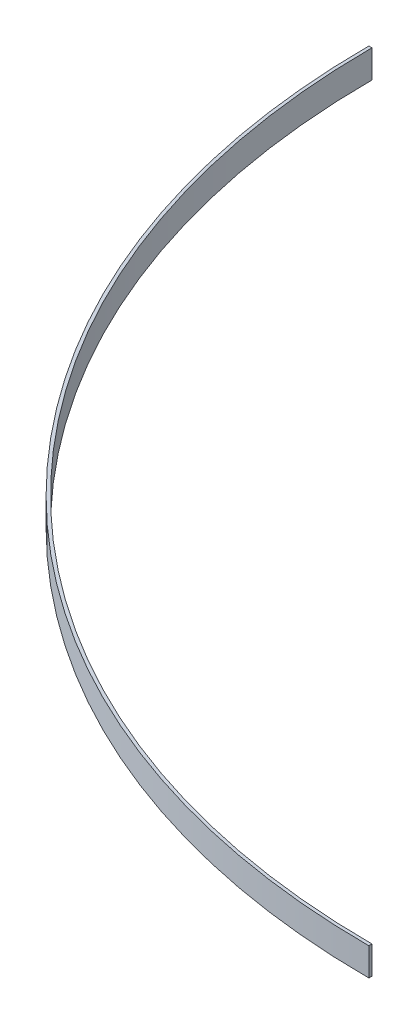
ISO-10303-21;
HEADER;
FILE_DESCRIPTION(('STEP AP214'),'2;1');
FILE_NAME('part.step','',(''),(''),'','','');
FILE_SCHEMA(('AUTOMOTIVE_DESIGN { 1 0 10303 214 1 1 1 1 }'));
ENDSEC;
DATA;
#1=APPLICATION_CONTEXT('core data for automotive mechanical design processes');
#2=APPLICATION_PROTOCOL_DEFINITION('international standard','automotive_design',2000,#1);
#3=PRODUCT_CONTEXT('',#1,'mechanical');
#4=PRODUCT('Part','Part','',(#3));
#5=PRODUCT_RELATED_PRODUCT_CATEGORY('part','',(#4));
#6=PRODUCT_DEFINITION_FORMATION('','',#4);
#7=PRODUCT_DEFINITION_CONTEXT('part definition',#1,'design');
#8=PRODUCT_DEFINITION('design','',#6,#7);
#9=PRODUCT_DEFINITION_SHAPE('','',#8);
#10=(LENGTH_UNIT() NAMED_UNIT(*) SI_UNIT(.MILLI.,.METRE.));
#11=(NAMED_UNIT(*) PLANE_ANGLE_UNIT() SI_UNIT($,.RADIAN.));
#12=(NAMED_UNIT(*) SI_UNIT($,.STERADIAN.) SOLID_ANGLE_UNIT());
#13=UNCERTAINTY_MEASURE_WITH_UNIT(LENGTH_MEASURE(1.E-05),#10,'distance_accuracy_value','');
#14=(GEOMETRIC_REPRESENTATION_CONTEXT(3) GLOBAL_UNCERTAINTY_ASSIGNED_CONTEXT((#13)) GLOBAL_UNIT_ASSIGNED_CONTEXT((#10,
#11,#12)) REPRESENTATION_CONTEXT('',''));
#15=CARTESIAN_POINT('',(0.,0.,0.));
#16=DIRECTION('',(0.,0.,1.));
#17=DIRECTION('',(1.,0.,0.));
#18=AXIS2_PLACEMENT_3D('',#15,#16,#17);
#19=CARTESIAN_POINT('',(-92.4999999999995,-18.,92.4999999999995));
#20=DIRECTION('',(0.,1.,0.));
#21=DIRECTION('',(0.,0.,1.));
#22=AXIS2_PLACEMENT_3D('',#19,#20,#21);
#23=PLANE('',#22);
#24=DIRECTION('',(0.,0.,-1.));
#25=VECTOR('',#24,1.);
#26=CARTESIAN_POINT('',(-92.4999999999994,-18.,592.5));
#27=LINE('',#26,#25);
#28=CARTESIAN_POINT('',(-92.4999999999995,-18.,594.5));
#29=VERTEX_POINT('',#28);
#30=CARTESIAN_POINT('',(-92.4999999999994,-18.,592.5));
#31=VERTEX_POINT('',#30);
#32=EDGE_CURVE('E11',#29,#31,#27,.T.);
#33=ORIENTED_EDGE('',*,*,#32,.F.);
#34=CARTESIAN_POINT('',(-92.4999999999995,-18.,92.4999999999995));
#35=DIRECTION('',(0.,1.,0.));
#36=DIRECTION('',(0.,0.,1.));
#37=AXIS2_PLACEMENT_3D('',#34,#35,#36);
#38=CIRCLE('',#37,502.000000000001);
#39=CARTESIAN_POINT('',(-594.5,-18.,92.4999999999994));
#40=VERTEX_POINT('',#39);
#41=EDGE_CURVE('E72',#29,#40,#38,.F.);
#42=ORIENTED_EDGE('',*,*,#41,.T.);
#43=DIRECTION('',(1.,0.,0.));
#44=VECTOR('',#43,1.);
#45=CARTESIAN_POINT('',(-592.5,-18.,92.4999999999996));
#46=LINE('',#45,#44);
#47=CARTESIAN_POINT('',(-592.5,-18.,92.4999999999996));
#48=VERTEX_POINT('',#47);
#49=EDGE_CURVE('E46',#40,#48,#46,.T.);
#50=ORIENTED_EDGE('',*,*,#49,.T.);
#51=CARTESIAN_POINT('',(-92.4999999999995,-18.,92.4999999999995));
#52=DIRECTION('',(0.,-1.,0.));
#53=DIRECTION('',(0.,0.,-1.));
#54=AXIS2_PLACEMENT_3D('',#51,#52,#53);
#55=CIRCLE('',#54,500.000000000001);
#56=EDGE_CURVE('E75',#31,#48,#55,.T.);
#57=ORIENTED_EDGE('',*,*,#56,.F.);
#58=EDGE_LOOP('',(#33,#42,#50,#57));
#59=FACE_BOUND('',#58,.T.);
#60=ADVANCED_FACE('F36',(#59),#23,.F.);
#61=CARTESIAN_POINT('',(-592.5,-9.00000000000001,92.4999999999997));
#62=DIRECTION('',(0.,0.,1.));
#63=DIRECTION('',(0.,1.,0.));
#64=AXIS2_PLACEMENT_3D('',#61,#62,#63);
#65=PLANE('',#64);
#66=ORIENTED_EDGE('',*,*,#49,.F.);
#67=DIRECTION('',(0.,1.,0.));
#68=VECTOR('',#67,1.);
#69=CARTESIAN_POINT('',(-594.5,-795.46531627197,92.4999999999994));
#70=LINE('',#69,#68);
#71=CARTESIAN_POINT('',(-594.5,0.,92.4999999999994));
#72=VERTEX_POINT('',#71);
#73=EDGE_CURVE('E87',#40,#72,#70,.T.);
#74=ORIENTED_EDGE('',*,*,#73,.T.);
#75=DIRECTION('',(1.,0.,0.));
#76=VECTOR('',#75,1.);
#77=CARTESIAN_POINT('',(-592.5,0.,92.4999999999997));
#78=LINE('',#77,#76);
#79=CARTESIAN_POINT('',(-592.5,0.,92.4999999999997));
#80=VERTEX_POINT('',#79);
#81=EDGE_CURVE('E96',#72,#80,#78,.T.);
#82=ORIENTED_EDGE('',*,*,#81,.T.);
#83=DIRECTION('',(0.,1.,0.));
#84=VECTOR('',#83,1.);
#85=CARTESIAN_POINT('',(-592.5,-18.,92.4999999999997));
#86=LINE('',#85,#84);
#87=EDGE_CURVE('E91',#48,#80,#86,.T.);
#88=ORIENTED_EDGE('',*,*,#87,.F.);
#89=EDGE_LOOP('',(#66,#74,#82,#88));
#90=FACE_BOUND('',#89,.T.);
#91=ADVANCED_FACE('F104',(#90),#65,.F.);
#92=CARTESIAN_POINT('',(-92.4999999999995,0.,92.4999999999995));
#93=DIRECTION('',(0.,-1.,0.));
#94=DIRECTION('',(0.,0.,-1.));
#95=AXIS2_PLACEMENT_3D('',#92,#93,#94);
#96=PLANE('',#95);
#97=ORIENTED_EDGE('',*,*,#81,.F.);
#98=CARTESIAN_POINT('',(-92.4999999999995,0.,92.4999999999995));
#99=DIRECTION('',(0.,1.,0.));
#100=DIRECTION('',(0.,0.,1.));
#101=AXIS2_PLACEMENT_3D('',#98,#99,#100);
#102=CIRCLE('',#101,502.000000000001);
#103=CARTESIAN_POINT('',(-92.4999999999995,0.,594.5));
#104=VERTEX_POINT('',#103);
#105=EDGE_CURVE('E89',#72,#104,#102,.T.);
#106=ORIENTED_EDGE('',*,*,#105,.T.);
#107=DIRECTION('',(0.,0.,-1.));
#108=VECTOR('',#107,1.);
#109=CARTESIAN_POINT('',(-92.4999999999995,0.,592.5));
#110=LINE('',#109,#108);
#111=CARTESIAN_POINT('',(-92.4999999999995,0.,592.5));
#112=VERTEX_POINT('',#111);
#113=EDGE_CURVE('E40',#104,#112,#110,.T.);
#114=ORIENTED_EDGE('',*,*,#113,.T.);
#115=CARTESIAN_POINT('',(-92.4999999999995,0.,92.4999999999995));
#116=DIRECTION('',(0.,1.,0.));
#117=DIRECTION('',(0.,0.,1.));
#118=AXIS2_PLACEMENT_3D('',#115,#116,#117);
#119=CIRCLE('',#118,500.000000000001);
#120=EDGE_CURVE('E105',#80,#112,#119,.T.);
#121=ORIENTED_EDGE('',*,*,#120,.F.);
#122=EDGE_LOOP('',(#97,#106,#114,#121));
#123=FACE_BOUND('',#122,.T.);
#124=ADVANCED_FACE('F109',(#123),#96,.F.);
#125=CARTESIAN_POINT('',(-92.4999999999995,-9.00000000000001,592.5));
#126=DIRECTION('',(-1.,0.,0.));
#127=DIRECTION('',(0.,-1.,0.));
#128=AXIS2_PLACEMENT_3D('',#125,#126,#127);
#129=PLANE('',#128);
#130=DIRECTION('',(0.,1.,0.));
#131=VECTOR('',#130,1.);
#132=CARTESIAN_POINT('',(-92.4999999999995,-795.46531627197,594.5));
#133=LINE('',#132,#131);
#134=EDGE_CURVE('E85',#104,#29,#133,.F.);
#135=ORIENTED_EDGE('',*,*,#134,.T.);
#136=ORIENTED_EDGE('',*,*,#32,.T.);
#137=DIRECTION('',(0.,-1.,0.));
#138=VECTOR('',#137,1.);
#139=CARTESIAN_POINT('',(-92.4999999999995,0.,592.5));
#140=LINE('',#139,#138);
#141=EDGE_CURVE('E103',#112,#31,#140,.T.);
#142=ORIENTED_EDGE('',*,*,#141,.F.);
#143=ORIENTED_EDGE('',*,*,#113,.F.);
#144=EDGE_LOOP('',(#135,#136,#142,#143));
#145=FACE_BOUND('',#144,.T.);
#146=ADVANCED_FACE('F38',(#145),#129,.F.);
#147=CARTESIAN_POINT('',(-92.4999999999995,-795.46531627197,92.4999999999995));
#148=DIRECTION('',(0.,1.,0.));
#149=DIRECTION('',(0.,0.,1.));
#150=AXIS2_PLACEMENT_3D('',#147,#148,#149);
#151=CYLINDRICAL_SURFACE('',#150,500.000000000001);
#152=ORIENTED_EDGE('',*,*,#120,.T.);
#153=ORIENTED_EDGE('',*,*,#141,.T.);
#154=ORIENTED_EDGE('',*,*,#56,.T.);
#155=ORIENTED_EDGE('',*,*,#87,.T.);
#156=EDGE_LOOP('',(#152,#153,#154,#155));
#157=FACE_BOUND('',#156,.T.);
#158=ADVANCED_FACE('F102',(#157),#151,.F.);
#159=CARTESIAN_POINT('',(-92.4999999999995,-795.46531627197,92.4999999999995));
#160=DIRECTION('',(0.,1.,0.));
#161=DIRECTION('',(0.,0.,1.));
#162=AXIS2_PLACEMENT_3D('',#159,#160,#161);
#163=CYLINDRICAL_SURFACE('',#162,502.000000000001);
#164=ORIENTED_EDGE('',*,*,#105,.F.);
#165=ORIENTED_EDGE('',*,*,#73,.F.);
#166=ORIENTED_EDGE('',*,*,#41,.F.);
#167=ORIENTED_EDGE('',*,*,#134,.F.);
#168=EDGE_LOOP('',(#164,#165,#166,#167));
#169=FACE_BOUND('',#168,.T.);
#170=ADVANCED_FACE('F84',(#169),#163,.T.);
#171=CLOSED_SHELL('',(#60,#91,#124,#146,#158,#170));
#172=MANIFOLD_SOLID_BREP('B2',#171);
#173=ADVANCED_BREP_SHAPE_REPRESENTATION('',(#18,#172),#14);
#174=SHAPE_DEFINITION_REPRESENTATION(#9,#173);
ENDSEC;
END-ISO-10303-21;
